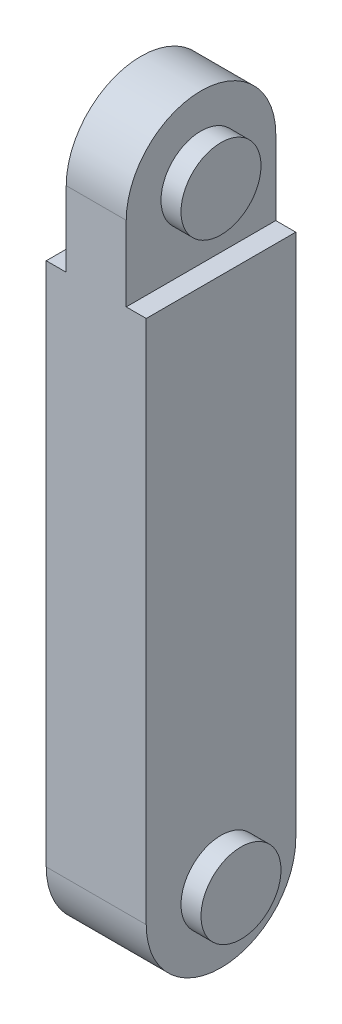
ISO-10303-21;
HEADER;
FILE_DESCRIPTION(('STEP AP214'),'2;1');
FILE_NAME('part.step','',(''),(''),'','','');
FILE_SCHEMA(('AUTOMOTIVE_DESIGN { 1 0 10303 214 1 1 1 1 }'));
ENDSEC;
DATA;
#1=APPLICATION_CONTEXT('core data for automotive mechanical design processes');
#2=APPLICATION_PROTOCOL_DEFINITION('international standard','automotive_design',2000,#1);
#3=PRODUCT_CONTEXT('',#1,'mechanical');
#4=PRODUCT('Part','Part','',(#3));
#5=PRODUCT_RELATED_PRODUCT_CATEGORY('part','',(#4));
#6=PRODUCT_DEFINITION_FORMATION('','',#4);
#7=PRODUCT_DEFINITION_CONTEXT('part definition',#1,'design');
#8=PRODUCT_DEFINITION('design','',#6,#7);
#9=PRODUCT_DEFINITION_SHAPE('','',#8);
#10=(LENGTH_UNIT() NAMED_UNIT(*) SI_UNIT(.MILLI.,.METRE.));
#11=(NAMED_UNIT(*) PLANE_ANGLE_UNIT() SI_UNIT($,.RADIAN.));
#12=(NAMED_UNIT(*) SI_UNIT($,.STERADIAN.) SOLID_ANGLE_UNIT());
#13=UNCERTAINTY_MEASURE_WITH_UNIT(LENGTH_MEASURE(1.E-05),#10,'distance_accuracy_value','');
#14=(GEOMETRIC_REPRESENTATION_CONTEXT(3) GLOBAL_UNCERTAINTY_ASSIGNED_CONTEXT((#13)) GLOBAL_UNIT_ASSIGNED_CONTEXT((#10,
#11,#12)) REPRESENTATION_CONTEXT('',''));
#15=CARTESIAN_POINT('',(0.,0.,0.));
#16=DIRECTION('',(0.,0.,1.));
#17=DIRECTION('',(1.,0.,0.));
#18=AXIS2_PLACEMENT_3D('',#15,#16,#17);
#19=CARTESIAN_POINT('',(20.,600.,0.));
#20=DIRECTION('',(1.,0.,0.));
#21=DIRECTION('',(0.,0.,-1.));
#22=AXIS2_PLACEMENT_3D('',#19,#20,#21);
#23=PLANE('',#22);
#24=CARTESIAN_POINT('',(20.,600.,0.));
#25=DIRECTION('',(-1.,0.,0.));
#26=DIRECTION('',(0.,0.,-1.));
#27=AXIS2_PLACEMENT_3D('',#24,#25,#26);
#28=CIRCLE('',#27,74.7678036336063);
#29=CARTESIAN_POINT('',(20.,600.,74.7678036336063));
#30=VERTEX_POINT('',#29);
#31=CARTESIAN_POINT('',(20.,599.999999999999,-74.7678036336063));
#32=VERTEX_POINT('',#31);
#33=EDGE_CURVE('E128',#30,#32,#28,.T.);
#34=ORIENTED_EDGE('',*,*,#33,.T.);
#35=DIRECTION('',(0.,-1.,0.));
#36=VECTOR('',#35,1.);
#37=CARTESIAN_POINT('',(20.,599.999999999999,-74.7678036336063));
#38=LINE('',#37,#36);
#39=CARTESIAN_POINT('',(20.,524.999999999999,-74.7678036336063));
#40=VERTEX_POINT('',#39);
#41=EDGE_CURVE('E131',#32,#40,#38,.T.);
#42=ORIENTED_EDGE('',*,*,#41,.T.);
#43=DIRECTION('',(0.,0.,1.));
#44=VECTOR('',#43,1.);
#45=CARTESIAN_POINT('',(20.,525.,74.7678036336063));
#46=LINE('',#45,#44);
#47=CARTESIAN_POINT('',(20.,525.,74.7678036336063));
#48=VERTEX_POINT('',#47);
#49=EDGE_CURVE('E134',#40,#48,#46,.T.);
#50=ORIENTED_EDGE('',*,*,#49,.T.);
#51=DIRECTION('',(0.,1.,0.));
#52=VECTOR('',#51,1.);
#53=CARTESIAN_POINT('',(20.,600.,74.7678036336063));
#54=LINE('',#53,#52);
#55=EDGE_CURVE('E137',#48,#30,#54,.T.);
#56=ORIENTED_EDGE('',*,*,#55,.T.);
#57=EDGE_LOOP('',(#34,#42,#50,#56));
#58=FACE_BOUND('',#57,.T.);
#59=CARTESIAN_POINT('',(20.,600.,0.));
#60=DIRECTION('',(1.,0.,0.));
#61=DIRECTION('',(0.,0.,-1.));
#62=AXIS2_PLACEMENT_3D('',#59,#60,#61);
#63=CIRCLE('',#62,40.);
#64=CARTESIAN_POINT('',(20.,600.,-40.));
#65=VERTEX_POINT('',#64);
#66=EDGE_CURVE('E11',#65,#65,#63,.F.);
#67=ORIENTED_EDGE('',*,*,#66,.F.);
#68=EDGE_LOOP('',(#67));
#69=FACE_BOUND('',#68,.T.);
#70=ADVANCED_FACE('F32',(#58,#69),#23,.F.);
#71=CARTESIAN_POINT('',(80.,600.,0.));
#72=DIRECTION('',(-1.,0.,0.));
#73=DIRECTION('',(0.,0.,1.));
#74=AXIS2_PLACEMENT_3D('',#71,#72,#73);
#75=PLANE('',#74);
#76=DIRECTION('',(0.,-1.,0.));
#77=VECTOR('',#76,1.);
#78=CARTESIAN_POINT('',(80.,600.,-74.7678036336063));
#79=LINE('',#78,#77);
#80=CARTESIAN_POINT('',(80.,600.,-74.7678036336063));
#81=VERTEX_POINT('',#80);
#82=CARTESIAN_POINT('',(80.,525.,-74.7678036336063));
#83=VERTEX_POINT('',#82);
#84=EDGE_CURVE('E101',#81,#83,#79,.T.);
#85=ORIENTED_EDGE('',*,*,#84,.F.);
#86=CARTESIAN_POINT('',(80.,600.,0.));
#87=DIRECTION('',(-1.,0.,0.));
#88=DIRECTION('',(0.,0.,1.));
#89=AXIS2_PLACEMENT_3D('',#86,#87,#88);
#90=CIRCLE('',#89,74.7678036336063);
#91=CARTESIAN_POINT('',(80.,600.,74.7678036336063));
#92=VERTEX_POINT('',#91);
#93=EDGE_CURVE('E125',#92,#81,#90,.T.);
#94=ORIENTED_EDGE('',*,*,#93,.F.);
#95=DIRECTION('',(0.,-1.,0.));
#96=VECTOR('',#95,1.);
#97=CARTESIAN_POINT('',(80.,600.,74.7678036336063));
#98=LINE('',#97,#96);
#99=CARTESIAN_POINT('',(80.,525.,74.7678036336063));
#100=VERTEX_POINT('',#99);
#101=EDGE_CURVE('E104',#92,#100,#98,.T.);
#102=ORIENTED_EDGE('',*,*,#101,.T.);
#103=DIRECTION('',(0.,0.,1.));
#104=VECTOR('',#103,1.);
#105=CARTESIAN_POINT('',(80.,525.,-74.7678036336063));
#106=LINE('',#105,#104);
#107=EDGE_CURVE('E96',#83,#100,#106,.T.);
#108=ORIENTED_EDGE('',*,*,#107,.F.);
#109=EDGE_LOOP('',(#85,#94,#102,#108));
#110=FACE_BOUND('',#109,.T.);
#111=CARTESIAN_POINT('',(80.,600.,0.));
#112=DIRECTION('',(-1.,0.,0.));
#113=DIRECTION('',(0.,0.,1.));
#114=AXIS2_PLACEMENT_3D('',#111,#112,#113);
#115=CIRCLE('',#114,40.);
#116=CARTESIAN_POINT('',(80.,600.,40.));
#117=VERTEX_POINT('',#116);
#118=EDGE_CURVE('E40',#117,#117,#115,.F.);
#119=ORIENTED_EDGE('',*,*,#118,.F.);
#120=EDGE_LOOP('',(#119));
#121=FACE_BOUND('',#120,.T.);
#122=ADVANCED_FACE('F98',(#110,#121),#75,.F.);
#123=CARTESIAN_POINT('',(100.,0.,0.));
#124=DIRECTION('',(1.,0.,0.));
#125=DIRECTION('',(0.,0.,-1.));
#126=AXIS2_PLACEMENT_3D('',#123,#124,#125);
#127=PLANE('',#126);
#128=DIRECTION('',(0.,1.,0.));
#129=VECTOR('',#128,1.);
#130=CARTESIAN_POINT('',(100.,0.,-74.7678036336063));
#131=LINE('',#130,#129);
#132=CARTESIAN_POINT('',(100.,0.,-74.7678036336063));
#133=VERTEX_POINT('',#132);
#134=CARTESIAN_POINT('',(100.,525.,-74.7678036336063));
#135=VERTEX_POINT('',#134);
#136=EDGE_CURVE('E149',#133,#135,#131,.T.);
#137=ORIENTED_EDGE('',*,*,#136,.T.);
#138=DIRECTION('',(0.,0.,1.));
#139=VECTOR('',#138,1.);
#140=CARTESIAN_POINT('',(100.,525.,-74.7678036336063));
#141=LINE('',#140,#139);
#142=CARTESIAN_POINT('',(100.,525.,74.7678036336063));
#143=VERTEX_POINT('',#142);
#144=EDGE_CURVE('E109',#135,#143,#141,.T.);
#145=ORIENTED_EDGE('',*,*,#144,.T.);
#146=DIRECTION('',(0.,1.,0.));
#147=VECTOR('',#146,1.);
#148=CARTESIAN_POINT('',(100.,0.,74.7678036336063));
#149=LINE('',#148,#147);
#150=CARTESIAN_POINT('',(100.,0.,74.7678036336063));
#151=VERTEX_POINT('',#150);
#152=EDGE_CURVE('E152',#151,#143,#149,.T.);
#153=ORIENTED_EDGE('',*,*,#152,.F.);
#154=CARTESIAN_POINT('',(100.,0.,0.));
#155=DIRECTION('',(1.,0.,0.));
#156=DIRECTION('',(0.,0.,-1.));
#157=AXIS2_PLACEMENT_3D('',#154,#155,#156);
#158=CIRCLE('',#157,74.7678036336063);
#159=EDGE_CURVE('E146',#151,#133,#158,.T.);
#160=ORIENTED_EDGE('',*,*,#159,.T.);
#161=EDGE_LOOP('',(#137,#145,#153,#160));
#162=FACE_BOUND('',#161,.T.);
#163=CARTESIAN_POINT('',(100.,0.,0.));
#164=DIRECTION('',(1.,0.,0.));
#165=DIRECTION('',(0.,0.,-1.));
#166=AXIS2_PLACEMENT_3D('',#163,#164,#165);
#167=CIRCLE('',#166,40.);
#168=CARTESIAN_POINT('',(100.,0.,-40.));
#169=VERTEX_POINT('',#168);
#170=EDGE_CURVE('E350',#169,#169,#167,.T.);
#171=ORIENTED_EDGE('',*,*,#170,.F.);
#172=EDGE_LOOP('',(#171));
#173=FACE_BOUND('',#172,.T.);
#174=ADVANCED_FACE('F177',(#162,#173),#127,.T.);
#175=CARTESIAN_POINT('',(0.,0.,0.));
#176=DIRECTION('',(1.,0.,0.));
#177=DIRECTION('',(0.,0.,-1.));
#178=AXIS2_PLACEMENT_3D('',#175,#176,#177);
#179=PLANE('',#178);
#180=DIRECTION('',(0.,1.,0.));
#181=VECTOR('',#180,1.);
#182=CARTESIAN_POINT('',(0.,0.,74.7678036336063));
#183=LINE('',#182,#181);
#184=CARTESIAN_POINT('',(0.,0.,74.7678036336063));
#185=VERTEX_POINT('',#184);
#186=CARTESIAN_POINT('',(0.,525.,74.7678036336063));
#187=VERTEX_POINT('',#186);
#188=EDGE_CURVE('E150',#185,#187,#183,.T.);
#189=ORIENTED_EDGE('',*,*,#188,.T.);
#190=DIRECTION('',(0.,0.,1.));
#191=VECTOR('',#190,1.);
#192=CARTESIAN_POINT('',(0.,525.,74.7678036336063));
#193=LINE('',#192,#191);
#194=CARTESIAN_POINT('',(0.,524.999999999999,-74.7678036336063));
#195=VERTEX_POINT('',#194);
#196=EDGE_CURVE('E112',#195,#187,#193,.T.);
#197=ORIENTED_EDGE('',*,*,#196,.F.);
#198=DIRECTION('',(0.,1.,0.));
#199=VECTOR('',#198,1.);
#200=CARTESIAN_POINT('',(0.,0.,-74.7678036336063));
#201=LINE('',#200,#199);
#202=CARTESIAN_POINT('',(0.,0.,-74.7678036336063));
#203=VERTEX_POINT('',#202);
#204=EDGE_CURVE('E158',#203,#195,#201,.T.);
#205=ORIENTED_EDGE('',*,*,#204,.F.);
#206=CARTESIAN_POINT('',(0.,0.,0.));
#207=DIRECTION('',(1.,0.,0.));
#208=DIRECTION('',(0.,0.,-1.));
#209=AXIS2_PLACEMENT_3D('',#206,#207,#208);
#210=CIRCLE('',#209,74.7678036336063);
#211=EDGE_CURVE('E144',#185,#203,#210,.T.);
#212=ORIENTED_EDGE('',*,*,#211,.F.);
#213=EDGE_LOOP('',(#189,#197,#205,#212));
#214=FACE_BOUND('',#213,.T.);
#215=CARTESIAN_POINT('',(0.,0.,0.));
#216=DIRECTION('',(1.,0.,0.));
#217=DIRECTION('',(0.,0.,-1.));
#218=AXIS2_PLACEMENT_3D('',#215,#216,#217);
#219=CIRCLE('',#218,40.);
#220=CARTESIAN_POINT('',(0.,0.,-40.));
#221=VERTEX_POINT('',#220);
#222=EDGE_CURVE('E170',#221,#221,#219,.F.);
#223=ORIENTED_EDGE('',*,*,#222,.F.);
#224=EDGE_LOOP('',(#223));
#225=FACE_BOUND('',#224,.T.);
#226=ADVANCED_FACE('F183',(#214,#225),#179,.F.);
#227=CARTESIAN_POINT('',(100.,0.,-74.7678036336063));
#228=DIRECTION('',(0.,0.,1.));
#229=DIRECTION('',(0.,-1.,0.));
#230=AXIS2_PLACEMENT_3D('',#227,#228,#229);
#231=PLANE('',#230);
#232=DIRECTION('',(1.,0.,0.));
#233=VECTOR('',#232,1.);
#234=CARTESIAN_POINT('',(80.,525.,-74.7678036336063));
#235=LINE('',#234,#233);
#236=EDGE_CURVE('E107',#83,#135,#235,.T.);
#237=ORIENTED_EDGE('',*,*,#236,.T.);
#238=ORIENTED_EDGE('',*,*,#136,.F.);
#239=DIRECTION('',(-1.,0.,0.));
#240=VECTOR('',#239,1.);
#241=CARTESIAN_POINT('',(100.,0.,-74.7678036336063));
#242=LINE('',#241,#240);
#243=EDGE_CURVE('E167',#133,#203,#242,.T.);
#244=ORIENTED_EDGE('',*,*,#243,.T.);
#245=ORIENTED_EDGE('',*,*,#204,.T.);
#246=DIRECTION('',(-1.,0.,0.));
#247=VECTOR('',#246,1.);
#248=CARTESIAN_POINT('',(20.,524.999999999999,-74.7678036336063));
#249=LINE('',#248,#247);
#250=EDGE_CURVE('E55',#40,#195,#249,.T.);
#251=ORIENTED_EDGE('',*,*,#250,.F.);
#252=ORIENTED_EDGE('',*,*,#41,.F.);
#253=DIRECTION('',(-1.,0.,0.));
#254=VECTOR('',#253,1.);
#255=CARTESIAN_POINT('',(100.,599.999999999999,-74.7678036336063));
#256=LINE('',#255,#254);
#257=EDGE_CURVE('E117',#81,#32,#256,.T.);
#258=ORIENTED_EDGE('',*,*,#257,.F.);
#259=ORIENTED_EDGE('',*,*,#84,.T.);
#260=EDGE_LOOP('',(#237,#238,#244,#245,#251,#252,#258,#259));
#261=FACE_BOUND('',#260,.T.);
#262=ADVANCED_FACE('F115',(#261),#231,.F.);
#263=CARTESIAN_POINT('',(100.,0.,74.7678036336063));
#264=DIRECTION('',(0.,0.,1.));
#265=DIRECTION('',(1.,0.,0.));
#266=AXIS2_PLACEMENT_3D('',#263,#264,#265);
#267=PLANE('',#266);
#268=ORIENTED_EDGE('',*,*,#152,.T.);
#269=DIRECTION('',(1.,0.,0.));
#270=VECTOR('',#269,1.);
#271=CARTESIAN_POINT('',(80.,525.,74.7678036336063));
#272=LINE('',#271,#270);
#273=EDGE_CURVE('E47',#100,#143,#272,.T.);
#274=ORIENTED_EDGE('',*,*,#273,.F.);
#275=ORIENTED_EDGE('',*,*,#101,.F.);
#276=DIRECTION('',(-1.,0.,0.));
#277=VECTOR('',#276,1.);
#278=CARTESIAN_POINT('',(100.,600.,74.7678036336063));
#279=LINE('',#278,#277);
#280=EDGE_CURVE('E164',#92,#30,#279,.T.);
#281=ORIENTED_EDGE('',*,*,#280,.T.);
#282=ORIENTED_EDGE('',*,*,#55,.F.);
#283=DIRECTION('',(-1.,0.,0.));
#284=VECTOR('',#283,1.);
#285=CARTESIAN_POINT('',(20.,525.,74.7678036336063));
#286=LINE('',#285,#284);
#287=EDGE_CURVE('E141',#48,#187,#286,.T.);
#288=ORIENTED_EDGE('',*,*,#287,.T.);
#289=ORIENTED_EDGE('',*,*,#188,.F.);
#290=DIRECTION('',(-1.,0.,0.));
#291=VECTOR('',#290,1.);
#292=CARTESIAN_POINT('',(100.,0.,74.7678036336063));
#293=LINE('',#292,#291);
#294=EDGE_CURVE('E155',#151,#185,#293,.T.);
#295=ORIENTED_EDGE('',*,*,#294,.F.);
#296=EDGE_LOOP('',(#268,#274,#275,#281,#282,#288,#289,#295));
#297=FACE_BOUND('',#296,.T.);
#298=ADVANCED_FACE('F201',(#297),#267,.T.);
#299=CARTESIAN_POINT('',(100.,0.,0.));
#300=DIRECTION('',(-1.,0.,0.));
#301=DIRECTION('',(0.,0.,1.));
#302=AXIS2_PLACEMENT_3D('',#299,#300,#301);
#303=CYLINDRICAL_SURFACE('',#302,74.7678036336063);
#304=ORIENTED_EDGE('',*,*,#211,.T.);
#305=ORIENTED_EDGE('',*,*,#243,.F.);
#306=ORIENTED_EDGE('',*,*,#159,.F.);
#307=ORIENTED_EDGE('',*,*,#294,.T.);
#308=EDGE_LOOP('',(#304,#305,#306,#307));
#309=FACE_BOUND('',#308,.T.);
#310=ADVANCED_FACE('F34',(#309),#303,.T.);
#311=CARTESIAN_POINT('',(100.,600.,0.));
#312=DIRECTION('',(-1.,0.,0.));
#313=DIRECTION('',(0.,0.,1.));
#314=AXIS2_PLACEMENT_3D('',#311,#312,#313);
#315=CYLINDRICAL_SURFACE('',#314,74.7678036336063);
#316=ORIENTED_EDGE('',*,*,#93,.T.);
#317=ORIENTED_EDGE('',*,*,#257,.T.);
#318=ORIENTED_EDGE('',*,*,#33,.F.);
#319=ORIENTED_EDGE('',*,*,#280,.F.);
#320=EDGE_LOOP('',(#316,#317,#318,#319));
#321=FACE_BOUND('',#320,.T.);
#322=ADVANCED_FACE('F196',(#321),#315,.T.);
#323=CARTESIAN_POINT('',(20.,525.,74.7678036336063));
#324=DIRECTION('',(0.,-1.,0.));
#325=DIRECTION('',(0.,0.,-1.));
#326=AXIS2_PLACEMENT_3D('',#323,#324,#325);
#327=PLANE('',#326);
#328=ORIENTED_EDGE('',*,*,#196,.T.);
#329=ORIENTED_EDGE('',*,*,#287,.F.);
#330=ORIENTED_EDGE('',*,*,#49,.F.);
#331=ORIENTED_EDGE('',*,*,#250,.T.);
#332=EDGE_LOOP('',(#328,#329,#330,#331));
#333=FACE_BOUND('',#332,.T.);
#334=ADVANCED_FACE('F193',(#333),#327,.F.);
#335=CARTESIAN_POINT('',(80.,525.,-74.7678036336063));
#336=DIRECTION('',(0.,1.,0.));
#337=DIRECTION('',(0.,0.,1.));
#338=AXIS2_PLACEMENT_3D('',#335,#336,#337);
#339=PLANE('',#338);
#340=ORIENTED_EDGE('',*,*,#144,.F.);
#341=ORIENTED_EDGE('',*,*,#236,.F.);
#342=ORIENTED_EDGE('',*,*,#107,.T.);
#343=ORIENTED_EDGE('',*,*,#273,.T.);
#344=EDGE_LOOP('',(#340,#341,#342,#343));
#345=FACE_BOUND('',#344,.T.);
#346=ADVANCED_FACE('F108',(#345),#339,.T.);
#347=CARTESIAN_POINT('',(-20.,0.,0.));
#348=DIRECTION('',(1.,0.,0.));
#349=DIRECTION('',(0.,0.,-1.));
#350=AXIS2_PLACEMENT_3D('',#347,#348,#349);
#351=CYLINDRICAL_SURFACE('',#350,40.);
#352=CARTESIAN_POINT('',(-20.,0.,0.));
#353=DIRECTION('',(-1.,0.,0.));
#354=DIRECTION('',(0.,0.,1.));
#355=AXIS2_PLACEMENT_3D('',#352,#353,#354);
#356=CIRCLE('',#355,40.);
#357=CARTESIAN_POINT('',(-20.,0.,40.));
#358=VERTEX_POINT('',#357);
#359=EDGE_CURVE('E119',#358,#358,#356,.T.);
#360=ORIENTED_EDGE('',*,*,#359,.F.);
#361=EDGE_LOOP('',(#360));
#362=FACE_BOUND('',#361,.T.);
#363=ORIENTED_EDGE('',*,*,#222,.T.);
#364=EDGE_LOOP('',(#363));
#365=FACE_BOUND('',#364,.T.);
#366=ADVANCED_FACE('F190',(#362,#365),#351,.T.);
#367=CARTESIAN_POINT('',(-20.,0.,0.));
#368=DIRECTION('',(-1.,0.,0.));
#369=DIRECTION('',(0.,0.,1.));
#370=AXIS2_PLACEMENT_3D('',#367,#368,#369);
#371=PLANE('',#370);
#372=ORIENTED_EDGE('',*,*,#359,.T.);
#373=EDGE_LOOP('',(#372));
#374=FACE_BOUND('',#373,.T.);
#375=ADVANCED_FACE('F240',(#374),#371,.T.);
#376=CARTESIAN_POINT('',(120.,0.,0.));
#377=DIRECTION('',(-1.,0.,0.));
#378=DIRECTION('',(0.,0.,1.));
#379=AXIS2_PLACEMENT_3D('',#376,#377,#378);
#380=CYLINDRICAL_SURFACE('',#379,40.);
#381=CARTESIAN_POINT('',(120.,0.,0.));
#382=DIRECTION('',(1.,0.,0.));
#383=DIRECTION('',(0.,0.,-1.));
#384=AXIS2_PLACEMENT_3D('',#381,#382,#383);
#385=CIRCLE('',#384,40.);
#386=CARTESIAN_POINT('',(120.,0.,-40.));
#387=VERTEX_POINT('',#386);
#388=EDGE_CURVE('E353',#387,#387,#385,.T.);
#389=ORIENTED_EDGE('',*,*,#388,.F.);
#390=EDGE_LOOP('',(#389));
#391=FACE_BOUND('',#390,.T.);
#392=ORIENTED_EDGE('',*,*,#170,.T.);
#393=EDGE_LOOP('',(#392));
#394=FACE_BOUND('',#393,.T.);
#395=ADVANCED_FACE('F247',(#391,#394),#380,.T.);
#396=CARTESIAN_POINT('',(120.,0.,0.));
#397=DIRECTION('',(1.,0.,0.));
#398=DIRECTION('',(0.,0.,-1.));
#399=AXIS2_PLACEMENT_3D('',#396,#397,#398);
#400=PLANE('',#399);
#401=ORIENTED_EDGE('',*,*,#388,.T.);
#402=EDGE_LOOP('',(#401));
#403=FACE_BOUND('',#402,.T.);
#404=ADVANCED_FACE('F255',(#403),#400,.T.);
#405=CARTESIAN_POINT('',(100.,600.,0.));
#406=DIRECTION('',(-1.,0.,0.));
#407=DIRECTION('',(0.,0.,1.));
#408=AXIS2_PLACEMENT_3D('',#405,#406,#407);
#409=CYLINDRICAL_SURFACE('',#408,40.);
#410=CARTESIAN_POINT('',(100.,600.,0.));
#411=DIRECTION('',(1.,0.,0.));
#412=DIRECTION('',(0.,0.,-1.));
#413=AXIS2_PLACEMENT_3D('',#410,#411,#412);
#414=CIRCLE('',#413,40.);
#415=CARTESIAN_POINT('',(100.,600.,-40.));
#416=VERTEX_POINT('',#415);
#417=EDGE_CURVE('E347',#416,#416,#414,.T.);
#418=ORIENTED_EDGE('',*,*,#417,.F.);
#419=EDGE_LOOP('',(#418));
#420=FACE_BOUND('',#419,.T.);
#421=ORIENTED_EDGE('',*,*,#118,.T.);
#422=EDGE_LOOP('',(#421));
#423=FACE_BOUND('',#422,.T.);
#424=ADVANCED_FACE('F175',(#420,#423),#409,.T.);
#425=CARTESIAN_POINT('',(100.,600.,0.));
#426=DIRECTION('',(1.,0.,0.));
#427=DIRECTION('',(0.,0.,-1.));
#428=AXIS2_PLACEMENT_3D('',#425,#426,#427);
#429=PLANE('',#428);
#430=ORIENTED_EDGE('',*,*,#417,.T.);
#431=EDGE_LOOP('',(#430));
#432=FACE_BOUND('',#431,.T.);
#433=ADVANCED_FACE('F270',(#432),#429,.T.);
#434=CARTESIAN_POINT('',(0.,600.,0.));
#435=DIRECTION('',(1.,0.,0.));
#436=DIRECTION('',(0.,0.,-1.));
#437=AXIS2_PLACEMENT_3D('',#434,#435,#436);
#438=CYLINDRICAL_SURFACE('',#437,40.);
#439=CARTESIAN_POINT('',(0.,600.,0.));
#440=DIRECTION('',(-1.,0.,0.));
#441=DIRECTION('',(0.,0.,1.));
#442=AXIS2_PLACEMENT_3D('',#439,#440,#441);
#443=CIRCLE('',#442,40.);
#444=CARTESIAN_POINT('',(0.,600.,40.));
#445=VERTEX_POINT('',#444);
#446=EDGE_CURVE('E346',#445,#445,#443,.T.);
#447=ORIENTED_EDGE('',*,*,#446,.F.);
#448=EDGE_LOOP('',(#447));
#449=FACE_BOUND('',#448,.T.);
#450=ORIENTED_EDGE('',*,*,#66,.T.);
#451=EDGE_LOOP('',(#450));
#452=FACE_BOUND('',#451,.T.);
#453=ADVANCED_FACE('F278',(#449,#452),#438,.T.);
#454=CARTESIAN_POINT('',(0.,600.,0.));
#455=DIRECTION('',(-1.,0.,0.));
#456=DIRECTION('',(0.,0.,1.));
#457=AXIS2_PLACEMENT_3D('',#454,#455,#456);
#458=PLANE('',#457);
#459=ORIENTED_EDGE('',*,*,#446,.T.);
#460=EDGE_LOOP('',(#459));
#461=FACE_BOUND('',#460,.T.);
#462=ADVANCED_FACE('F287',(#461),#458,.T.);
#463=CLOSED_SHELL('',(#70,#122,#174,#226,#262,#298,#310,#322,#334,#346,#366,#375,#395,#404,#424,
#433,#453,#462));
#464=MANIFOLD_SOLID_BREP('B2',#463);
#465=ADVANCED_BREP_SHAPE_REPRESENTATION('',(#18,#464),#14);
#466=SHAPE_DEFINITION_REPRESENTATION(#9,#465);
ENDSEC;
END-ISO-10303-21;
